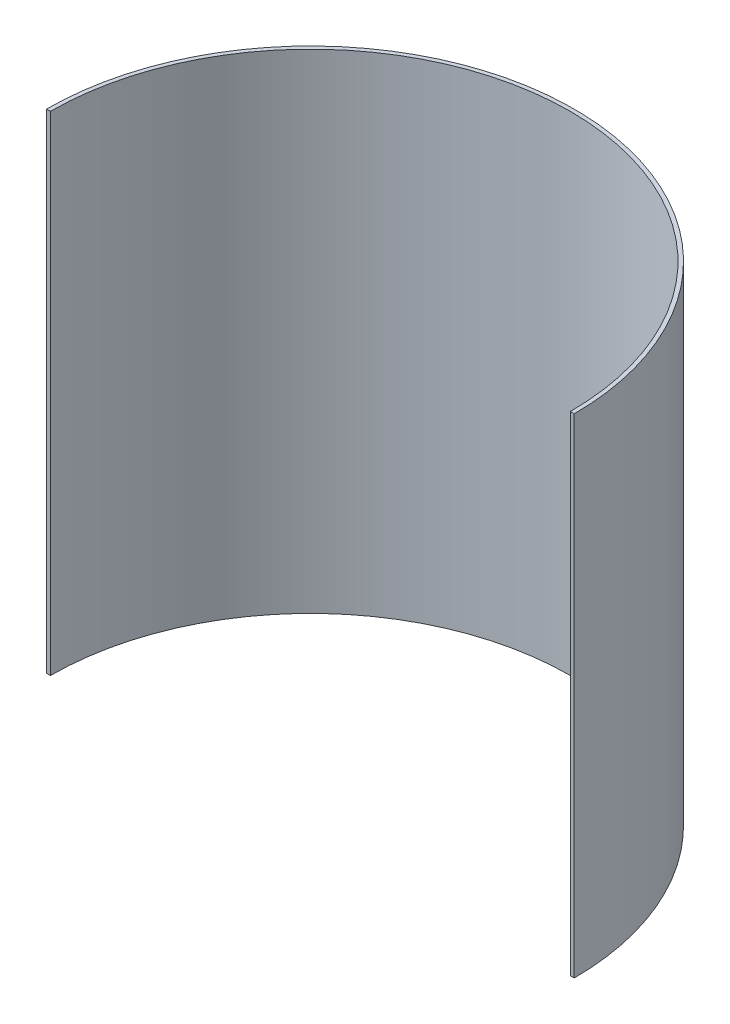
ISO-10303-21;
HEADER;
FILE_DESCRIPTION(('STEP AP214'),'2;1');
FILE_NAME('part.step','',(''),(''),'','','');
FILE_SCHEMA(('AUTOMOTIVE_DESIGN { 1 0 10303 214 1 1 1 1 }'));
ENDSEC;
DATA;
#1=APPLICATION_CONTEXT('core data for automotive mechanical design processes');
#2=APPLICATION_PROTOCOL_DEFINITION('international standard','automotive_design',2000,#1);
#3=PRODUCT_CONTEXT('',#1,'mechanical');
#4=PRODUCT('Part','Part','',(#3));
#5=PRODUCT_RELATED_PRODUCT_CATEGORY('part','',(#4));
#6=PRODUCT_DEFINITION_FORMATION('','',#4);
#7=PRODUCT_DEFINITION_CONTEXT('part definition',#1,'design');
#8=PRODUCT_DEFINITION('design','',#6,#7);
#9=PRODUCT_DEFINITION_SHAPE('','',#8);
#10=(LENGTH_UNIT() NAMED_UNIT(*) SI_UNIT(.MILLI.,.METRE.));
#11=(NAMED_UNIT(*) PLANE_ANGLE_UNIT() SI_UNIT($,.RADIAN.));
#12=(NAMED_UNIT(*) SI_UNIT($,.STERADIAN.) SOLID_ANGLE_UNIT());
#13=UNCERTAINTY_MEASURE_WITH_UNIT(LENGTH_MEASURE(1.E-05),#10,'distance_accuracy_value','');
#14=(GEOMETRIC_REPRESENTATION_CONTEXT(3) GLOBAL_UNCERTAINTY_ASSIGNED_CONTEXT((#13)) GLOBAL_UNIT_ASSIGNED_CONTEXT((#10,
#11,#12)) REPRESENTATION_CONTEXT('',''));
#15=CARTESIAN_POINT('',(0.,0.,0.));
#16=DIRECTION('',(0.,0.,1.));
#17=DIRECTION('',(1.,0.,0.));
#18=AXIS2_PLACEMENT_3D('',#15,#16,#17);
#19=CARTESIAN_POINT('',(0.,0.,-67.5));
#20=DIRECTION('',(0.,1.,0.));
#21=DIRECTION('',(1.,0.,0.));
#22=AXIS2_PLACEMENT_3D('',#19,#20,#21);
#23=PLANE('',#22);
#24=CARTESIAN_POINT('',(0.,0.,0.));
#25=DIRECTION('',(0.,1.,0.));
#26=DIRECTION('',(1.,0.,0.));
#27=AXIS2_PLACEMENT_3D('',#24,#25,#26);
#28=CIRCLE('',#27,135.);
#29=CARTESIAN_POINT('',(135.,0.,0.));
#30=VERTEX_POINT('',#29);
#31=CARTESIAN_POINT('',(-135.,0.,0.));
#32=VERTEX_POINT('',#31);
#33=EDGE_CURVE('E26',#30,#32,#28,.T.);
#34=ORIENTED_EDGE('',*,*,#33,.F.);
#35=DIRECTION('',(1.,0.,0.));
#36=VECTOR('',#35,1.);
#37=CARTESIAN_POINT('',(133.,0.,0.));
#38=LINE('',#37,#36);
#39=CARTESIAN_POINT('',(133.,0.,0.));
#40=VERTEX_POINT('',#39);
#41=EDGE_CURVE('E82',#40,#30,#38,.T.);
#42=ORIENTED_EDGE('',*,*,#41,.F.);
#43=CARTESIAN_POINT('',(0.,0.,0.));
#44=DIRECTION('',(0.,-1.,0.));
#45=DIRECTION('',(-1.,0.,0.));
#46=AXIS2_PLACEMENT_3D('',#43,#44,#45);
#47=CIRCLE('',#46,133.);
#48=CARTESIAN_POINT('',(-133.,0.,0.));
#49=VERTEX_POINT('',#48);
#50=EDGE_CURVE('E63',#49,#40,#47,.T.);
#51=ORIENTED_EDGE('',*,*,#50,.F.);
#52=DIRECTION('',(1.,0.,0.));
#53=VECTOR('',#52,1.);
#54=CARTESIAN_POINT('',(-135.,0.,0.));
#55=LINE('',#54,#53);
#56=EDGE_CURVE('E95',#32,#49,#55,.T.);
#57=ORIENTED_EDGE('',*,*,#56,.F.);
#58=EDGE_LOOP('',(#34,#42,#51,#57));
#59=FACE_BOUND('',#58,.T.);
#60=ADVANCED_FACE('F16',(#59),#23,.F.);
#61=CARTESIAN_POINT('',(0.,250.,-67.5));
#62=DIRECTION('',(0.,1.,0.));
#63=DIRECTION('',(1.,0.,0.));
#64=AXIS2_PLACEMENT_3D('',#61,#62,#63);
#65=PLANE('',#64);
#66=CARTESIAN_POINT('',(0.,250.,0.));
#67=DIRECTION('',(0.,1.,0.));
#68=DIRECTION('',(1.,0.,0.));
#69=AXIS2_PLACEMENT_3D('',#66,#67,#68);
#70=CIRCLE('',#69,135.);
#71=CARTESIAN_POINT('',(135.,250.,0.));
#72=VERTEX_POINT('',#71);
#73=CARTESIAN_POINT('',(-135.,250.,0.));
#74=VERTEX_POINT('',#73);
#75=EDGE_CURVE('E11',#72,#74,#70,.T.);
#76=ORIENTED_EDGE('',*,*,#75,.T.);
#77=DIRECTION('',(1.,0.,0.));
#78=VECTOR('',#77,1.);
#79=CARTESIAN_POINT('',(-135.,250.,0.));
#80=LINE('',#79,#78);
#81=CARTESIAN_POINT('',(-133.,250.,0.));
#82=VERTEX_POINT('',#81);
#83=EDGE_CURVE('E93',#74,#82,#80,.T.);
#84=ORIENTED_EDGE('',*,*,#83,.T.);
#85=CARTESIAN_POINT('',(0.,250.,0.));
#86=DIRECTION('',(0.,-1.,0.));
#87=DIRECTION('',(-1.,0.,0.));
#88=AXIS2_PLACEMENT_3D('',#85,#86,#87);
#89=CIRCLE('',#88,133.);
#90=CARTESIAN_POINT('',(133.,250.,0.));
#91=VERTEX_POINT('',#90);
#92=EDGE_CURVE('E76',#82,#91,#89,.T.);
#93=ORIENTED_EDGE('',*,*,#92,.T.);
#94=DIRECTION('',(1.,0.,0.));
#95=VECTOR('',#94,1.);
#96=CARTESIAN_POINT('',(133.,250.,0.));
#97=LINE('',#96,#95);
#98=EDGE_CURVE('E83',#91,#72,#97,.T.);
#99=ORIENTED_EDGE('',*,*,#98,.T.);
#100=EDGE_LOOP('',(#76,#84,#93,#99));
#101=FACE_BOUND('',#100,.T.);
#102=ADVANCED_FACE('F114',(#101),#65,.T.);
#103=CARTESIAN_POINT('',(0.,0.,0.));
#104=DIRECTION('',(0.,1.,0.));
#105=DIRECTION('',(1.,0.,0.));
#106=AXIS2_PLACEMENT_3D('',#103,#104,#105);
#107=CYLINDRICAL_SURFACE('',#106,135.);
#108=ORIENTED_EDGE('',*,*,#33,.T.);
#109=DIRECTION('',(0.,1.,0.));
#110=VECTOR('',#109,1.);
#111=CARTESIAN_POINT('',(-135.,0.,0.));
#112=LINE('',#111,#110);
#113=EDGE_CURVE('E20',#32,#74,#112,.T.);
#114=ORIENTED_EDGE('',*,*,#113,.T.);
#115=ORIENTED_EDGE('',*,*,#75,.F.);
#116=DIRECTION('',(0.,1.,0.));
#117=VECTOR('',#116,1.);
#118=CARTESIAN_POINT('',(135.,0.,0.));
#119=LINE('',#118,#117);
#120=EDGE_CURVE('E87',#30,#72,#119,.T.);
#121=ORIENTED_EDGE('',*,*,#120,.F.);
#122=EDGE_LOOP('',(#108,#114,#115,#121));
#123=FACE_BOUND('',#122,.T.);
#124=ADVANCED_FACE('F112',(#123),#107,.T.);
#125=CARTESIAN_POINT('',(-135.,0.,0.));
#126=DIRECTION('',(0.,0.,1.));
#127=DIRECTION('',(1.,0.,0.));
#128=AXIS2_PLACEMENT_3D('',#125,#126,#127);
#129=PLANE('',#128);
#130=ORIENTED_EDGE('',*,*,#56,.T.);
#131=DIRECTION('',(0.,1.,0.));
#132=VECTOR('',#131,1.);
#133=CARTESIAN_POINT('',(-133.,0.,0.));
#134=LINE('',#133,#132);
#135=EDGE_CURVE('E71',#49,#82,#134,.T.);
#136=ORIENTED_EDGE('',*,*,#135,.T.);
#137=ORIENTED_EDGE('',*,*,#83,.F.);
#138=ORIENTED_EDGE('',*,*,#113,.F.);
#139=EDGE_LOOP('',(#130,#136,#137,#138));
#140=FACE_BOUND('',#139,.T.);
#141=ADVANCED_FACE('F18',(#140),#129,.T.);
#142=CARTESIAN_POINT('',(0.,0.,0.));
#143=DIRECTION('',(0.,1.,0.));
#144=DIRECTION('',(-1.,0.,0.));
#145=AXIS2_PLACEMENT_3D('',#142,#143,#144);
#146=CYLINDRICAL_SURFACE('',#145,133.);
#147=ORIENTED_EDGE('',*,*,#50,.T.);
#148=DIRECTION('',(0.,1.,0.));
#149=VECTOR('',#148,1.);
#150=CARTESIAN_POINT('',(133.,0.,0.));
#151=LINE('',#150,#149);
#152=EDGE_CURVE('E68',#40,#91,#151,.T.);
#153=ORIENTED_EDGE('',*,*,#152,.T.);
#154=ORIENTED_EDGE('',*,*,#92,.F.);
#155=ORIENTED_EDGE('',*,*,#135,.F.);
#156=EDGE_LOOP('',(#147,#153,#154,#155));
#157=FACE_BOUND('',#156,.T.);
#158=ADVANCED_FACE('F65',(#157),#146,.F.);
#159=CARTESIAN_POINT('',(133.,0.,0.));
#160=DIRECTION('',(0.,0.,1.));
#161=DIRECTION('',(1.,0.,0.));
#162=AXIS2_PLACEMENT_3D('',#159,#160,#161);
#163=PLANE('',#162);
#164=ORIENTED_EDGE('',*,*,#41,.T.);
#165=ORIENTED_EDGE('',*,*,#120,.T.);
#166=ORIENTED_EDGE('',*,*,#98,.F.);
#167=ORIENTED_EDGE('',*,*,#152,.F.);
#168=EDGE_LOOP('',(#164,#165,#166,#167));
#169=FACE_BOUND('',#168,.T.);
#170=ADVANCED_FACE('F80',(#169),#163,.T.);
#171=CLOSED_SHELL('',(#60,#102,#124,#141,#158,#170));
#172=MANIFOLD_SOLID_BREP('B1',#171);
#173=ADVANCED_BREP_SHAPE_REPRESENTATION('',(#18,#172),#14);
#174=SHAPE_DEFINITION_REPRESENTATION(#9,#173);
ENDSEC;
END-ISO-10303-21;
